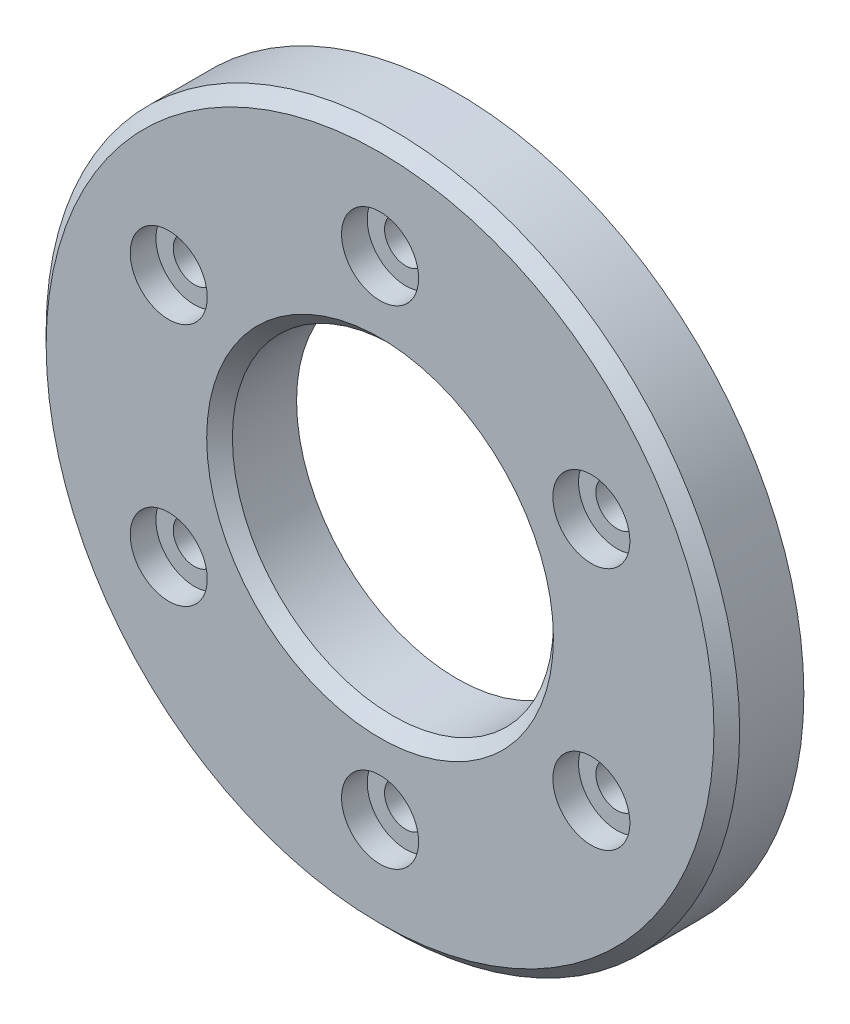
ISO-10303-21;
HEADER;
FILE_DESCRIPTION(('STEP AP214'),'2;1');
FILE_NAME('part.step','',(''),(''),'','','');
FILE_SCHEMA(('AUTOMOTIVE_DESIGN { 1 0 10303 214 1 1 1 1 }'));
ENDSEC;
DATA;
#1=APPLICATION_CONTEXT('core data for automotive mechanical design processes');
#2=APPLICATION_PROTOCOL_DEFINITION('international standard','automotive_design',2000,#1);
#3=PRODUCT_CONTEXT('',#1,'mechanical');
#4=PRODUCT('Part','Part','',(#3));
#5=PRODUCT_RELATED_PRODUCT_CATEGORY('part','',(#4));
#6=PRODUCT_DEFINITION_FORMATION('','',#4);
#7=PRODUCT_DEFINITION_CONTEXT('part definition',#1,'design');
#8=PRODUCT_DEFINITION('design','',#6,#7);
#9=PRODUCT_DEFINITION_SHAPE('','',#8);
#10=(LENGTH_UNIT() NAMED_UNIT(*) SI_UNIT(.MILLI.,.METRE.));
#11=(NAMED_UNIT(*) PLANE_ANGLE_UNIT() SI_UNIT($,.RADIAN.));
#12=(NAMED_UNIT(*) SI_UNIT($,.STERADIAN.) SOLID_ANGLE_UNIT());
#13=UNCERTAINTY_MEASURE_WITH_UNIT(LENGTH_MEASURE(1.E-05),#10,'distance_accuracy_value','');
#14=(GEOMETRIC_REPRESENTATION_CONTEXT(3) GLOBAL_UNCERTAINTY_ASSIGNED_CONTEXT((#13)) GLOBAL_UNIT_ASSIGNED_CONTEXT((#10,
#11,#12)) REPRESENTATION_CONTEXT('',''));
#15=CARTESIAN_POINT('',(0.,0.,0.));
#16=DIRECTION('',(0.,0.,1.));
#17=DIRECTION('',(1.,0.,0.));
#18=AXIS2_PLACEMENT_3D('',#15,#16,#17);
#19=CARTESIAN_POINT('',(0.,19.,6.));
#20=DIRECTION('',(0.,0.,-1.));
#21=DIRECTION('',(-1.,0.,0.));
#22=AXIS2_PLACEMENT_3D('',#19,#20,#21);
#23=CYLINDRICAL_SURFACE('',#22,1.65);
#24=CARTESIAN_POINT('',(0.,19.,0.));
#25=DIRECTION('',(0.,0.,1.));
#26=DIRECTION('',(1.,0.,0.));
#27=AXIS2_PLACEMENT_3D('',#24,#25,#26);
#28=CIRCLE('',#27,1.65);
#29=CARTESIAN_POINT('',(1.65,19.,0.));
#30=VERTEX_POINT('',#29);
#31=EDGE_CURVE('E99',#30,#30,#28,.T.);
#32=ORIENTED_EDGE('',*,*,#31,.F.);
#33=EDGE_LOOP('',(#32));
#34=FACE_BOUND('',#33,.T.);
#35=CARTESIAN_POINT('',(0.,19.,4.));
#36=DIRECTION('',(0.,0.,1.));
#37=DIRECTION('',(1.,0.,0.));
#38=AXIS2_PLACEMENT_3D('',#35,#36,#37);
#39=CIRCLE('',#38,1.65);
#40=CARTESIAN_POINT('',(1.65,19.,4.));
#41=VERTEX_POINT('',#40);
#42=EDGE_CURVE('E72',#41,#41,#39,.T.);
#43=ORIENTED_EDGE('',*,*,#42,.T.);
#44=EDGE_LOOP('',(#43));
#45=FACE_BOUND('',#44,.T.);
#46=ADVANCED_FACE('F44',(#34,#45),#23,.F.);
#47=CARTESIAN_POINT('',(16.4544826719044,9.49999999999996,6.));
#48=DIRECTION('',(0.,0.,-1.));
#49=DIRECTION('',(-1.,0.,0.));
#50=AXIS2_PLACEMENT_3D('',#47,#48,#49);
#51=CYLINDRICAL_SURFACE('',#50,1.65);
#52=CARTESIAN_POINT('',(16.4544826719044,9.49999999999996,0.));
#53=DIRECTION('',(0.,0.,1.));
#54=DIRECTION('',(1.,0.,0.));
#55=AXIS2_PLACEMENT_3D('',#52,#53,#54);
#56=CIRCLE('',#55,1.65);
#57=CARTESIAN_POINT('',(18.1044826719043,9.49999999999996,0.));
#58=VERTEX_POINT('',#57);
#59=EDGE_CURVE('E107',#58,#58,#56,.T.);
#60=ORIENTED_EDGE('',*,*,#59,.F.);
#61=EDGE_LOOP('',(#60));
#62=FACE_BOUND('',#61,.T.);
#63=CARTESIAN_POINT('',(16.4544826719044,9.49999999999996,4.));
#64=DIRECTION('',(0.,0.,1.));
#65=DIRECTION('',(1.,0.,0.));
#66=AXIS2_PLACEMENT_3D('',#63,#64,#65);
#67=CIRCLE('',#66,1.65);
#68=CARTESIAN_POINT('',(18.1044826719043,9.49999999999996,4.));
#69=VERTEX_POINT('',#68);
#70=EDGE_CURVE('E78',#69,#69,#67,.T.);
#71=ORIENTED_EDGE('',*,*,#70,.T.);
#72=EDGE_LOOP('',(#71));
#73=FACE_BOUND('',#72,.T.);
#74=ADVANCED_FACE('F220',(#62,#73),#51,.F.);
#75=CARTESIAN_POINT('',(16.4544826719043,-9.50000000000008,6.));
#76=DIRECTION('',(0.,0.,-1.));
#77=DIRECTION('',(-1.,0.,0.));
#78=AXIS2_PLACEMENT_3D('',#75,#76,#77);
#79=CYLINDRICAL_SURFACE('',#78,1.65);
#80=CARTESIAN_POINT('',(16.4544826719043,-9.50000000000008,0.));
#81=DIRECTION('',(0.,0.,1.));
#82=DIRECTION('',(1.,0.,0.));
#83=AXIS2_PLACEMENT_3D('',#80,#81,#82);
#84=CIRCLE('',#83,1.65);
#85=CARTESIAN_POINT('',(18.1044826719043,-9.50000000000008,0.));
#86=VERTEX_POINT('',#85);
#87=EDGE_CURVE('E115',#86,#86,#84,.T.);
#88=ORIENTED_EDGE('',*,*,#87,.F.);
#89=EDGE_LOOP('',(#88));
#90=FACE_BOUND('',#89,.T.);
#91=CARTESIAN_POINT('',(16.4544826719043,-9.50000000000008,4.));
#92=DIRECTION('',(0.,0.,1.));
#93=DIRECTION('',(1.,0.,0.));
#94=AXIS2_PLACEMENT_3D('',#91,#92,#93);
#95=CIRCLE('',#94,1.65);
#96=CARTESIAN_POINT('',(18.1044826719043,-9.50000000000008,4.));
#97=VERTEX_POINT('',#96);
#98=EDGE_CURVE('E76',#97,#97,#95,.T.);
#99=ORIENTED_EDGE('',*,*,#98,.T.);
#100=EDGE_LOOP('',(#99));
#101=FACE_BOUND('',#100,.T.);
#102=ADVANCED_FACE('F221',(#90,#101),#79,.F.);
#103=CARTESIAN_POINT('',(-1.32676290876039E-13,-19.,6.));
#104=DIRECTION('',(0.,0.,-1.));
#105=DIRECTION('',(-1.,0.,0.));
#106=AXIS2_PLACEMENT_3D('',#103,#104,#105);
#107=CYLINDRICAL_SURFACE('',#106,1.65);
#108=CARTESIAN_POINT('',(-1.32676290876039E-13,-19.,0.));
#109=DIRECTION('',(0.,0.,1.));
#110=DIRECTION('',(1.,0.,0.));
#111=AXIS2_PLACEMENT_3D('',#108,#109,#110);
#112=CIRCLE('',#111,1.65);
#113=CARTESIAN_POINT('',(1.64999999999987,-19.,0.));
#114=VERTEX_POINT('',#113);
#115=EDGE_CURVE('E118',#114,#114,#112,.T.);
#116=ORIENTED_EDGE('',*,*,#115,.F.);
#117=EDGE_LOOP('',(#116));
#118=FACE_BOUND('',#117,.T.);
#119=CARTESIAN_POINT('',(-1.32676290876039E-13,-19.,4.));
#120=DIRECTION('',(0.,0.,1.));
#121=DIRECTION('',(1.,0.,0.));
#122=AXIS2_PLACEMENT_3D('',#119,#120,#121);
#123=CIRCLE('',#122,1.65);
#124=CARTESIAN_POINT('',(1.64999999999987,-19.,4.));
#125=VERTEX_POINT('',#124);
#126=EDGE_CURVE('E83',#125,#125,#123,.T.);
#127=ORIENTED_EDGE('',*,*,#126,.T.);
#128=EDGE_LOOP('',(#127));
#129=FACE_BOUND('',#128,.T.);
#130=ADVANCED_FACE('F404',(#118,#129),#107,.F.);
#131=CARTESIAN_POINT('',(-16.4544826719044,-9.49999999999985,6.));
#132=DIRECTION('',(0.,0.,-1.));
#133=DIRECTION('',(-1.,0.,0.));
#134=AXIS2_PLACEMENT_3D('',#131,#132,#133);
#135=CYLINDRICAL_SURFACE('',#134,1.65);
#136=CARTESIAN_POINT('',(-16.4544826719044,-9.49999999999985,0.));
#137=DIRECTION('',(0.,0.,1.));
#138=DIRECTION('',(1.,0.,0.));
#139=AXIS2_PLACEMENT_3D('',#136,#137,#138);
#140=CIRCLE('',#139,1.65);
#141=CARTESIAN_POINT('',(-14.8044826719044,-9.49999999999985,0.));
#142=VERTEX_POINT('',#141);
#143=EDGE_CURVE('E116',#142,#142,#140,.T.);
#144=ORIENTED_EDGE('',*,*,#143,.F.);
#145=EDGE_LOOP('',(#144));
#146=FACE_BOUND('',#145,.T.);
#147=CARTESIAN_POINT('',(-16.4544826719044,-9.49999999999985,4.));
#148=DIRECTION('',(0.,0.,1.));
#149=DIRECTION('',(1.,0.,0.));
#150=AXIS2_PLACEMENT_3D('',#147,#148,#149);
#151=CIRCLE('',#150,1.65);
#152=CARTESIAN_POINT('',(-14.8044826719044,-9.49999999999985,4.));
#153=VERTEX_POINT('',#152);
#154=EDGE_CURVE('E86',#153,#153,#151,.T.);
#155=ORIENTED_EDGE('',*,*,#154,.T.);
#156=EDGE_LOOP('',(#155));
#157=FACE_BOUND('',#156,.T.);
#158=ADVANCED_FACE('F269',(#146,#157),#135,.F.);
#159=CARTESIAN_POINT('',(-16.4544826719042,9.50000000000019,6.));
#160=DIRECTION('',(0.,0.,-1.));
#161=DIRECTION('',(-1.,0.,0.));
#162=AXIS2_PLACEMENT_3D('',#159,#160,#161);
#163=CYLINDRICAL_SURFACE('',#162,1.65);
#164=CARTESIAN_POINT('',(-16.4544826719042,9.50000000000019,0.));
#165=DIRECTION('',(0.,0.,1.));
#166=DIRECTION('',(1.,0.,0.));
#167=AXIS2_PLACEMENT_3D('',#164,#165,#166);
#168=CIRCLE('',#167,1.65);
#169=CARTESIAN_POINT('',(-14.8044826719042,9.50000000000019,0.));
#170=VERTEX_POINT('',#169);
#171=EDGE_CURVE('E73',#170,#170,#168,.T.);
#172=ORIENTED_EDGE('',*,*,#171,.F.);
#173=EDGE_LOOP('',(#172));
#174=FACE_BOUND('',#173,.T.);
#175=CARTESIAN_POINT('',(-16.4544826719042,9.50000000000019,4.));
#176=DIRECTION('',(0.,0.,1.));
#177=DIRECTION('',(1.,0.,0.));
#178=AXIS2_PLACEMENT_3D('',#175,#176,#177);
#179=CIRCLE('',#178,1.65);
#180=CARTESIAN_POINT('',(-14.8044826719042,9.50000000000019,4.));
#181=VERTEX_POINT('',#180);
#182=EDGE_CURVE('E95',#181,#181,#179,.T.);
#183=ORIENTED_EDGE('',*,*,#182,.T.);
#184=EDGE_LOOP('',(#183));
#185=FACE_BOUND('',#184,.T.);
#186=ADVANCED_FACE('F187',(#174,#185),#163,.F.);
#187=CARTESIAN_POINT('',(0.,0.,6.));
#188=DIRECTION('',(0.,0.,1.));
#189=DIRECTION('',(1.,0.,0.));
#190=AXIS2_PLACEMENT_3D('',#187,#188,#189);
#191=PLANE('',#190);
#192=CARTESIAN_POINT('',(0.,0.,6.));
#193=DIRECTION('',(0.,0.,1.));
#194=DIRECTION('',(1.,0.,0.));
#195=AXIS2_PLACEMENT_3D('',#192,#193,#194);
#196=CIRCLE('',#195,13.5);
#197=CARTESIAN_POINT('',(13.5,0.,6.));
#198=VERTEX_POINT('',#197);
#199=EDGE_CURVE('E53',#198,#198,#196,.F.);
#200=ORIENTED_EDGE('',*,*,#199,.T.);
#201=EDGE_LOOP('',(#200));
#202=FACE_BOUND('',#201,.T.);
#203=CARTESIAN_POINT('',(0.,0.,6.));
#204=DIRECTION('',(0.,0.,1.));
#205=DIRECTION('',(1.,0.,0.));
#206=AXIS2_PLACEMENT_3D('',#203,#204,#205);
#207=CIRCLE('',#206,26.);
#208=CARTESIAN_POINT('',(26.,0.,6.));
#209=VERTEX_POINT('',#208);
#210=EDGE_CURVE('E56',#209,#209,#207,.T.);
#211=ORIENTED_EDGE('',*,*,#210,.T.);
#212=EDGE_LOOP('',(#211));
#213=FACE_BOUND('',#212,.T.);
#214=CARTESIAN_POINT('',(0.,19.,6.));
#215=DIRECTION('',(0.,0.,1.));
#216=DIRECTION('',(1.,0.,0.));
#217=AXIS2_PLACEMENT_3D('',#214,#215,#216);
#218=CIRCLE('',#217,3.);
#219=CARTESIAN_POINT('',(3.,19.,6.));
#220=VERTEX_POINT('',#219);
#221=EDGE_CURVE('E159',#220,#220,#218,.T.);
#222=ORIENTED_EDGE('',*,*,#221,.F.);
#223=EDGE_LOOP('',(#222));
#224=FACE_BOUND('',#223,.T.);
#225=CARTESIAN_POINT('',(-16.4544826719042,9.50000000000019,6.));
#226=DIRECTION('',(0.,0.,1.));
#227=DIRECTION('',(1.,0.,0.));
#228=AXIS2_PLACEMENT_3D('',#225,#226,#227);
#229=CIRCLE('',#228,3.);
#230=CARTESIAN_POINT('',(-13.4544826719042,9.50000000000019,6.));
#231=VERTEX_POINT('',#230);
#232=EDGE_CURVE('E134',#231,#231,#229,.T.);
#233=ORIENTED_EDGE('',*,*,#232,.F.);
#234=EDGE_LOOP('',(#233));
#235=FACE_BOUND('',#234,.T.);
#236=CARTESIAN_POINT('',(-16.4544826719044,-9.49999999999985,6.));
#237=DIRECTION('',(0.,0.,1.));
#238=DIRECTION('',(1.,0.,0.));
#239=AXIS2_PLACEMENT_3D('',#236,#237,#238);
#240=CIRCLE('',#239,3.);
#241=CARTESIAN_POINT('',(-13.4544826719044,-9.49999999999985,6.));
#242=VERTEX_POINT('',#241);
#243=EDGE_CURVE('E133',#242,#242,#240,.T.);
#244=ORIENTED_EDGE('',*,*,#243,.F.);
#245=EDGE_LOOP('',(#244));
#246=FACE_BOUND('',#245,.T.);
#247=CARTESIAN_POINT('',(-1.32676290876039E-13,-19.,6.));
#248=DIRECTION('',(0.,0.,1.));
#249=DIRECTION('',(1.,0.,0.));
#250=AXIS2_PLACEMENT_3D('',#247,#248,#249);
#251=CIRCLE('',#250,3.);
#252=CARTESIAN_POINT('',(2.99999999999987,-19.,6.));
#253=VERTEX_POINT('',#252);
#254=EDGE_CURVE('E139',#253,#253,#251,.T.);
#255=ORIENTED_EDGE('',*,*,#254,.F.);
#256=EDGE_LOOP('',(#255));
#257=FACE_BOUND('',#256,.T.);
#258=CARTESIAN_POINT('',(16.4544826719043,-9.50000000000008,6.));
#259=DIRECTION('',(0.,0.,1.));
#260=DIRECTION('',(1.,0.,0.));
#261=AXIS2_PLACEMENT_3D('',#258,#259,#260);
#262=CIRCLE('',#261,3.);
#263=CARTESIAN_POINT('',(19.4544826719043,-9.50000000000008,6.));
#264=VERTEX_POINT('',#263);
#265=EDGE_CURVE('E146',#264,#264,#262,.T.);
#266=ORIENTED_EDGE('',*,*,#265,.F.);
#267=EDGE_LOOP('',(#266));
#268=FACE_BOUND('',#267,.T.);
#269=CARTESIAN_POINT('',(16.4544826719044,9.49999999999996,6.));
#270=DIRECTION('',(0.,0.,1.));
#271=DIRECTION('',(1.,0.,0.));
#272=AXIS2_PLACEMENT_3D('',#269,#270,#271);
#273=CIRCLE('',#272,3.);
#274=CARTESIAN_POINT('',(19.4544826719044,9.49999999999996,6.));
#275=VERTEX_POINT('',#274);
#276=EDGE_CURVE('E156',#275,#275,#273,.T.);
#277=ORIENTED_EDGE('',*,*,#276,.F.);
#278=EDGE_LOOP('',(#277));
#279=FACE_BOUND('',#278,.T.);
#280=ADVANCED_FACE('F184',(#202,#213,#224,#235,#246,#257,#268,#279),#191,.T.);
#281=CARTESIAN_POINT('',(0.,0.,0.));
#282=DIRECTION('',(0.,0.,1.));
#283=DIRECTION('',(1.,0.,0.));
#284=AXIS2_PLACEMENT_3D('',#281,#282,#283);
#285=PLANE('',#284);
#286=CARTESIAN_POINT('',(0.,0.,0.));
#287=DIRECTION('',(0.,0.,1.));
#288=DIRECTION('',(1.,0.,0.));
#289=AXIS2_PLACEMENT_3D('',#286,#287,#288);
#290=CIRCLE('',#289,27.);
#291=CARTESIAN_POINT('',(27.,0.,0.));
#292=VERTEX_POINT('',#291);
#293=EDGE_CURVE('E69',#292,#292,#290,.T.);
#294=ORIENTED_EDGE('',*,*,#293,.F.);
#295=EDGE_LOOP('',(#294));
#296=FACE_BOUND('',#295,.T.);
#297=ORIENTED_EDGE('',*,*,#31,.T.);
#298=EDGE_LOOP('',(#297));
#299=FACE_BOUND('',#298,.T.);
#300=CARTESIAN_POINT('',(0.,0.,0.));
#301=DIRECTION('',(0.,0.,1.));
#302=DIRECTION('',(1.,0.,0.));
#303=AXIS2_PLACEMENT_3D('',#300,#301,#302);
#304=CIRCLE('',#303,12.5);
#305=CARTESIAN_POINT('',(12.5,0.,0.));
#306=VERTEX_POINT('',#305);
#307=EDGE_CURVE('E102',#306,#306,#304,.T.);
#308=ORIENTED_EDGE('',*,*,#307,.T.);
#309=EDGE_LOOP('',(#308));
#310=FACE_BOUND('',#309,.T.);
#311=ORIENTED_EDGE('',*,*,#59,.T.);
#312=EDGE_LOOP('',(#311));
#313=FACE_BOUND('',#312,.T.);
#314=ORIENTED_EDGE('',*,*,#87,.T.);
#315=EDGE_LOOP('',(#314));
#316=FACE_BOUND('',#315,.T.);
#317=ORIENTED_EDGE('',*,*,#115,.T.);
#318=EDGE_LOOP('',(#317));
#319=FACE_BOUND('',#318,.T.);
#320=ORIENTED_EDGE('',*,*,#143,.T.);
#321=EDGE_LOOP('',(#320));
#322=FACE_BOUND('',#321,.T.);
#323=ORIENTED_EDGE('',*,*,#171,.T.);
#324=EDGE_LOOP('',(#323));
#325=FACE_BOUND('',#324,.T.);
#326=ADVANCED_FACE('F189',(#296,#299,#310,#313,#316,#319,#322,#325),#285,.F.);
#327=CARTESIAN_POINT('',(0.,0.,6.));
#328=DIRECTION('',(0.,0.,-1.));
#329=DIRECTION('',(-1.,0.,0.));
#330=AXIS2_PLACEMENT_3D('',#327,#328,#329);
#331=CYLINDRICAL_SURFACE('',#330,27.);
#332=CARTESIAN_POINT('',(0.,0.,4.99999999999998));
#333=DIRECTION('',(0.,0.,1.));
#334=DIRECTION('',(1.,0.,0.));
#335=AXIS2_PLACEMENT_3D('',#332,#333,#334);
#336=CIRCLE('',#335,27.);
#337=CARTESIAN_POINT('',(27.,0.,4.99999999999998));
#338=VERTEX_POINT('',#337);
#339=EDGE_CURVE('E10',#338,#338,#336,.F.);
#340=ORIENTED_EDGE('',*,*,#339,.T.);
#341=EDGE_LOOP('',(#340));
#342=FACE_BOUND('',#341,.T.);
#343=ORIENTED_EDGE('',*,*,#293,.T.);
#344=EDGE_LOOP('',(#343));
#345=FACE_BOUND('',#344,.T.);
#346=ADVANCED_FACE('F232',(#342,#345),#331,.T.);
#347=CARTESIAN_POINT('',(0.,0.,6.));
#348=DIRECTION('',(0.,0.,-1.));
#349=DIRECTION('',(-1.,0.,0.));
#350=AXIS2_PLACEMENT_3D('',#347,#348,#349);
#351=CYLINDRICAL_SURFACE('',#350,12.5);
#352=CARTESIAN_POINT('',(0.,0.,5.00000000000001));
#353=DIRECTION('',(0.,0.,1.));
#354=DIRECTION('',(1.,0.,0.));
#355=AXIS2_PLACEMENT_3D('',#352,#353,#354);
#356=CIRCLE('',#355,12.5);
#357=CARTESIAN_POINT('',(12.5,0.,5.00000000000001));
#358=VERTEX_POINT('',#357);
#359=EDGE_CURVE('E65',#358,#358,#356,.T.);
#360=ORIENTED_EDGE('',*,*,#359,.T.);
#361=EDGE_LOOP('',(#360));
#362=FACE_BOUND('',#361,.T.);
#363=ORIENTED_EDGE('',*,*,#307,.F.);
#364=EDGE_LOOP('',(#363));
#365=FACE_BOUND('',#364,.T.);
#366=ADVANCED_FACE('F226',(#362,#365),#351,.F.);
#367=CARTESIAN_POINT('',(-16.4544826719042,9.50000000000019,4.));
#368=DIRECTION('',(0.,0.,1.));
#369=DIRECTION('',(1.,0.,0.));
#370=AXIS2_PLACEMENT_3D('',#367,#368,#369);
#371=CYLINDRICAL_SURFACE('',#370,3.);
#372=CARTESIAN_POINT('',(-16.4544826719042,9.50000000000019,4.));
#373=DIRECTION('',(0.,0.,1.));
#374=DIRECTION('',(1.,0.,0.));
#375=AXIS2_PLACEMENT_3D('',#372,#373,#374);
#376=CIRCLE('',#375,3.);
#377=CARTESIAN_POINT('',(-13.4544826719042,9.50000000000019,4.));
#378=VERTEX_POINT('',#377);
#379=EDGE_CURVE('E161',#378,#378,#376,.T.);
#380=ORIENTED_EDGE('',*,*,#379,.F.);
#381=EDGE_LOOP('',(#380));
#382=FACE_BOUND('',#381,.T.);
#383=ORIENTED_EDGE('',*,*,#232,.T.);
#384=EDGE_LOOP('',(#383));
#385=FACE_BOUND('',#384,.T.);
#386=ADVANCED_FACE('F255',(#382,#385),#371,.F.);
#387=CARTESIAN_POINT('',(-16.4544826719042,9.50000000000019,4.));
#388=DIRECTION('',(0.,0.,1.));
#389=DIRECTION('',(1.,0.,0.));
#390=AXIS2_PLACEMENT_3D('',#387,#388,#389);
#391=PLANE('',#390);
#392=ORIENTED_EDGE('',*,*,#182,.F.);
#393=EDGE_LOOP('',(#392));
#394=FACE_BOUND('',#393,.T.);
#395=ORIENTED_EDGE('',*,*,#379,.T.);
#396=EDGE_LOOP('',(#395));
#397=FACE_BOUND('',#396,.T.);
#398=ADVANCED_FACE('F273',(#394,#397),#391,.T.);
#399=CARTESIAN_POINT('',(-16.4544826719044,-9.49999999999985,4.));
#400=DIRECTION('',(0.,0.,1.));
#401=DIRECTION('',(1.,0.,0.));
#402=AXIS2_PLACEMENT_3D('',#399,#400,#401);
#403=CYLINDRICAL_SURFACE('',#402,3.);
#404=CARTESIAN_POINT('',(-16.4544826719044,-9.49999999999985,4.));
#405=DIRECTION('',(0.,0.,1.));
#406=DIRECTION('',(1.,0.,0.));
#407=AXIS2_PLACEMENT_3D('',#404,#405,#406);
#408=CIRCLE('',#407,3.);
#409=CARTESIAN_POINT('',(-13.4544826719044,-9.49999999999985,4.));
#410=VERTEX_POINT('',#409);
#411=EDGE_CURVE('E130',#410,#410,#408,.T.);
#412=ORIENTED_EDGE('',*,*,#411,.F.);
#413=EDGE_LOOP('',(#412));
#414=FACE_BOUND('',#413,.T.);
#415=ORIENTED_EDGE('',*,*,#243,.T.);
#416=EDGE_LOOP('',(#415));
#417=FACE_BOUND('',#416,.T.);
#418=ADVANCED_FACE('F280',(#414,#417),#403,.F.);
#419=CARTESIAN_POINT('',(-16.4544826719044,-9.49999999999985,4.));
#420=DIRECTION('',(0.,0.,1.));
#421=DIRECTION('',(1.,0.,0.));
#422=AXIS2_PLACEMENT_3D('',#419,#420,#421);
#423=PLANE('',#422);
#424=ORIENTED_EDGE('',*,*,#154,.F.);
#425=EDGE_LOOP('',(#424));
#426=FACE_BOUND('',#425,.T.);
#427=ORIENTED_EDGE('',*,*,#411,.T.);
#428=EDGE_LOOP('',(#427));
#429=FACE_BOUND('',#428,.T.);
#430=ADVANCED_FACE('F301',(#426,#429),#423,.T.);
#431=CARTESIAN_POINT('',(-1.32676290876039E-13,-19.,4.));
#432=DIRECTION('',(0.,0.,1.));
#433=DIRECTION('',(1.,0.,0.));
#434=AXIS2_PLACEMENT_3D('',#431,#432,#433);
#435=CYLINDRICAL_SURFACE('',#434,3.);
#436=CARTESIAN_POINT('',(-1.32676290876039E-13,-19.,4.));
#437=DIRECTION('',(0.,0.,1.));
#438=DIRECTION('',(1.,0.,0.));
#439=AXIS2_PLACEMENT_3D('',#436,#437,#438);
#440=CIRCLE('',#439,3.);
#441=CARTESIAN_POINT('',(2.99999999999987,-19.,4.));
#442=VERTEX_POINT('',#441);
#443=EDGE_CURVE('E136',#442,#442,#440,.T.);
#444=ORIENTED_EDGE('',*,*,#443,.F.);
#445=EDGE_LOOP('',(#444));
#446=FACE_BOUND('',#445,.T.);
#447=ORIENTED_EDGE('',*,*,#254,.T.);
#448=EDGE_LOOP('',(#447));
#449=FACE_BOUND('',#448,.T.);
#450=ADVANCED_FACE('F309',(#446,#449),#435,.F.);
#451=CARTESIAN_POINT('',(-1.32676290876039E-13,-19.,4.));
#452=DIRECTION('',(0.,0.,1.));
#453=DIRECTION('',(1.,0.,0.));
#454=AXIS2_PLACEMENT_3D('',#451,#452,#453);
#455=PLANE('',#454);
#456=ORIENTED_EDGE('',*,*,#126,.F.);
#457=EDGE_LOOP('',(#456));
#458=FACE_BOUND('',#457,.T.);
#459=ORIENTED_EDGE('',*,*,#443,.T.);
#460=EDGE_LOOP('',(#459));
#461=FACE_BOUND('',#460,.T.);
#462=ADVANCED_FACE('F317',(#458,#461),#455,.T.);
#463=CARTESIAN_POINT('',(16.4544826719043,-9.50000000000008,4.));
#464=DIRECTION('',(0.,0.,1.));
#465=DIRECTION('',(1.,0.,0.));
#466=AXIS2_PLACEMENT_3D('',#463,#464,#465);
#467=CYLINDRICAL_SURFACE('',#466,3.);
#468=CARTESIAN_POINT('',(16.4544826719043,-9.50000000000008,4.));
#469=DIRECTION('',(0.,0.,1.));
#470=DIRECTION('',(1.,0.,0.));
#471=AXIS2_PLACEMENT_3D('',#468,#469,#470);
#472=CIRCLE('',#471,3.);
#473=CARTESIAN_POINT('',(19.4544826719043,-9.50000000000008,4.));
#474=VERTEX_POINT('',#473);
#475=EDGE_CURVE('E145',#474,#474,#472,.T.);
#476=ORIENTED_EDGE('',*,*,#475,.F.);
#477=EDGE_LOOP('',(#476));
#478=FACE_BOUND('',#477,.T.);
#479=ORIENTED_EDGE('',*,*,#265,.T.);
#480=EDGE_LOOP('',(#479));
#481=FACE_BOUND('',#480,.T.);
#482=ADVANCED_FACE('F211',(#478,#481),#467,.F.);
#483=CARTESIAN_POINT('',(16.4544826719043,-9.50000000000008,4.));
#484=DIRECTION('',(0.,0.,1.));
#485=DIRECTION('',(1.,0.,0.));
#486=AXIS2_PLACEMENT_3D('',#483,#484,#485);
#487=PLANE('',#486);
#488=ORIENTED_EDGE('',*,*,#98,.F.);
#489=EDGE_LOOP('',(#488));
#490=FACE_BOUND('',#489,.T.);
#491=ORIENTED_EDGE('',*,*,#475,.T.);
#492=EDGE_LOOP('',(#491));
#493=FACE_BOUND('',#492,.T.);
#494=ADVANCED_FACE('F205',(#490,#493),#487,.T.);
#495=CARTESIAN_POINT('',(16.4544826719044,9.49999999999996,4.));
#496=DIRECTION('',(0.,0.,1.));
#497=DIRECTION('',(1.,0.,0.));
#498=AXIS2_PLACEMENT_3D('',#495,#496,#497);
#499=CYLINDRICAL_SURFACE('',#498,3.);
#500=CARTESIAN_POINT('',(16.4544826719044,9.49999999999996,4.));
#501=DIRECTION('',(0.,0.,1.));
#502=DIRECTION('',(1.,0.,0.));
#503=AXIS2_PLACEMENT_3D('',#500,#501,#502);
#504=CIRCLE('',#503,3.);
#505=CARTESIAN_POINT('',(19.4544826719044,9.49999999999996,4.));
#506=VERTEX_POINT('',#505);
#507=EDGE_CURVE('E155',#506,#506,#504,.T.);
#508=ORIENTED_EDGE('',*,*,#507,.F.);
#509=EDGE_LOOP('',(#508));
#510=FACE_BOUND('',#509,.T.);
#511=ORIENTED_EDGE('',*,*,#276,.T.);
#512=EDGE_LOOP('',(#511));
#513=FACE_BOUND('',#512,.T.);
#514=ADVANCED_FACE('F199',(#510,#513),#499,.F.);
#515=CARTESIAN_POINT('',(16.4544826719044,9.49999999999996,4.));
#516=DIRECTION('',(0.,0.,1.));
#517=DIRECTION('',(1.,0.,0.));
#518=AXIS2_PLACEMENT_3D('',#515,#516,#517);
#519=PLANE('',#518);
#520=ORIENTED_EDGE('',*,*,#70,.F.);
#521=EDGE_LOOP('',(#520));
#522=FACE_BOUND('',#521,.T.);
#523=ORIENTED_EDGE('',*,*,#507,.T.);
#524=EDGE_LOOP('',(#523));
#525=FACE_BOUND('',#524,.T.);
#526=ADVANCED_FACE('F179',(#522,#525),#519,.T.);
#527=CARTESIAN_POINT('',(0.,19.,4.));
#528=DIRECTION('',(0.,0.,1.));
#529=DIRECTION('',(1.,0.,0.));
#530=AXIS2_PLACEMENT_3D('',#527,#528,#529);
#531=CYLINDRICAL_SURFACE('',#530,3.);
#532=CARTESIAN_POINT('',(0.,19.,4.));
#533=DIRECTION('',(0.,0.,1.));
#534=DIRECTION('',(1.,0.,0.));
#535=AXIS2_PLACEMENT_3D('',#532,#533,#534);
#536=CIRCLE('',#535,3.);
#537=CARTESIAN_POINT('',(3.,19.,4.));
#538=VERTEX_POINT('',#537);
#539=EDGE_CURVE('E96',#538,#538,#536,.T.);
#540=ORIENTED_EDGE('',*,*,#539,.F.);
#541=EDGE_LOOP('',(#540));
#542=FACE_BOUND('',#541,.T.);
#543=ORIENTED_EDGE('',*,*,#221,.T.);
#544=EDGE_LOOP('',(#543));
#545=FACE_BOUND('',#544,.T.);
#546=ADVANCED_FACE('F180',(#542,#545),#531,.F.);
#547=CARTESIAN_POINT('',(0.,19.,4.));
#548=DIRECTION('',(0.,0.,1.));
#549=DIRECTION('',(1.,0.,0.));
#550=AXIS2_PLACEMENT_3D('',#547,#548,#549);
#551=PLANE('',#550);
#552=ORIENTED_EDGE('',*,*,#42,.F.);
#553=EDGE_LOOP('',(#552));
#554=FACE_BOUND('',#553,.T.);
#555=ORIENTED_EDGE('',*,*,#539,.T.);
#556=EDGE_LOOP('',(#555));
#557=FACE_BOUND('',#556,.T.);
#558=ADVANCED_FACE('F171',(#554,#557),#551,.T.);
#559=CARTESIAN_POINT('',(0.,0.,5.00000000000001));
#560=DIRECTION('',(0.,0.,1.));
#561=DIRECTION('',(1.,0.,0.));
#562=AXIS2_PLACEMENT_3D('',#559,#560,#561);
#563=CONICAL_SURFACE('',#562,12.5,0.785398163397451);
#564=ORIENTED_EDGE('',*,*,#199,.F.);
#565=EDGE_LOOP('',(#564));
#566=FACE_BOUND('',#565,.T.);
#567=ORIENTED_EDGE('',*,*,#359,.F.);
#568=EDGE_LOOP('',(#567));
#569=FACE_BOUND('',#568,.T.);
#570=ADVANCED_FACE('F240',(#566,#569),#563,.F.);
#571=CARTESIAN_POINT('',(0.,0.,6.));
#572=DIRECTION('',(0.,0.,-1.));
#573=DIRECTION('',(-1.,0.,0.));
#574=AXIS2_PLACEMENT_3D('',#571,#572,#573);
#575=CONICAL_SURFACE('',#574,26.,0.785398163397443);
#576=ORIENTED_EDGE('',*,*,#339,.F.);
#577=EDGE_LOOP('',(#576));
#578=FACE_BOUND('',#577,.T.);
#579=ORIENTED_EDGE('',*,*,#210,.F.);
#580=EDGE_LOOP('',(#579));
#581=FACE_BOUND('',#580,.T.);
#582=ADVANCED_FACE('F48',(#578,#581),#575,.T.);
#583=CLOSED_SHELL('',(#46,#74,#102,#130,#158,#186,#280,#326,#346,#366,#386,#398,#418,#430,#450,
#462,#482,#494,#514,#526,#546,#558,#570,#582));
#584=MANIFOLD_SOLID_BREP('B2',#583);
#585=ADVANCED_BREP_SHAPE_REPRESENTATION('',(#18,#584),#14);
#586=SHAPE_DEFINITION_REPRESENTATION(#9,#585);
ENDSEC;
END-ISO-10303-21;
